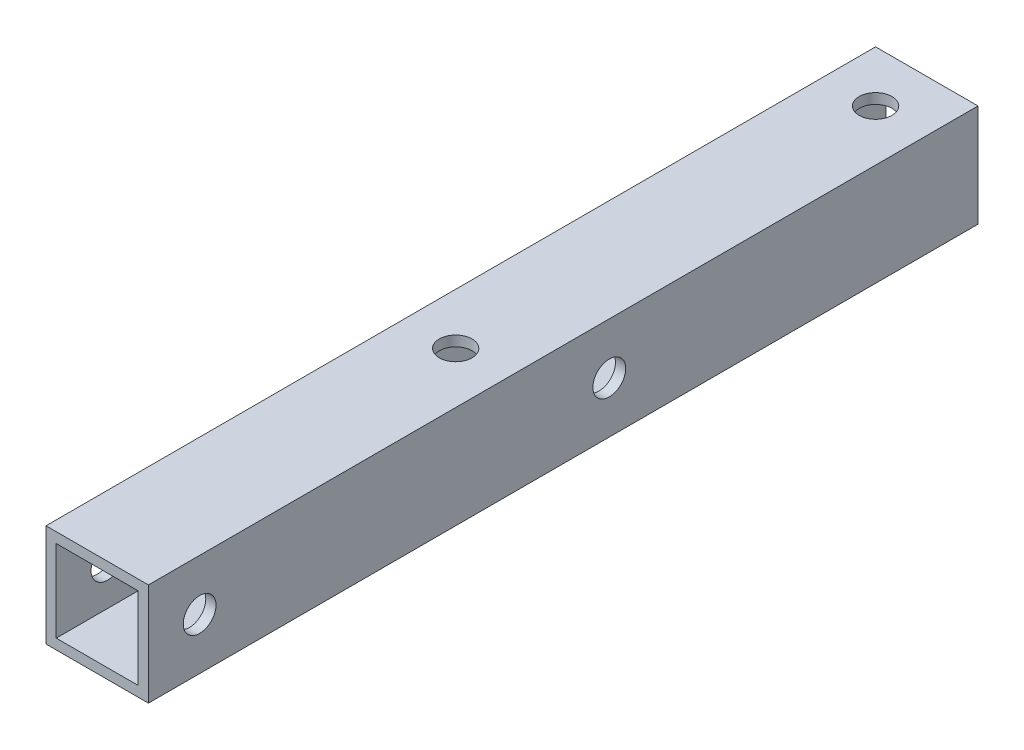
ISO-10303-21;
HEADER;
FILE_DESCRIPTION(('STEP AP214'),'2;1');
FILE_NAME('part.step','',(''),(''),'','','');
FILE_SCHEMA(('AUTOMOTIVE_DESIGN { 1 0 10303 214 1 1 1 1 }'));
ENDSEC;
DATA;
#1=APPLICATION_CONTEXT('core data for automotive mechanical design processes');
#2=APPLICATION_PROTOCOL_DEFINITION('international standard','automotive_design',2000,#1);
#3=PRODUCT_CONTEXT('',#1,'mechanical');
#4=PRODUCT('Part','Part','',(#3));
#5=PRODUCT_RELATED_PRODUCT_CATEGORY('part','',(#4));
#6=PRODUCT_DEFINITION_FORMATION('','',#4);
#7=PRODUCT_DEFINITION_CONTEXT('part definition',#1,'design');
#8=PRODUCT_DEFINITION('design','',#6,#7);
#9=PRODUCT_DEFINITION_SHAPE('','',#8);
#10=(LENGTH_UNIT() NAMED_UNIT(*) SI_UNIT(.MILLI.,.METRE.));
#11=(NAMED_UNIT(*) PLANE_ANGLE_UNIT() SI_UNIT($,.RADIAN.));
#12=(NAMED_UNIT(*) SI_UNIT($,.STERADIAN.) SOLID_ANGLE_UNIT());
#13=UNCERTAINTY_MEASURE_WITH_UNIT(LENGTH_MEASURE(1.E-05),#10,'distance_accuracy_value','');
#14=(GEOMETRIC_REPRESENTATION_CONTEXT(3) GLOBAL_UNCERTAINTY_ASSIGNED_CONTEXT((#13)) GLOBAL_UNIT_ASSIGNED_CONTEXT((#10,
#11,#12)) REPRESENTATION_CONTEXT('',''));
#15=CARTESIAN_POINT('',(0.,0.,0.));
#16=DIRECTION('',(0.,0.,1.));
#17=DIRECTION('',(1.,0.,0.));
#18=AXIS2_PLACEMENT_3D('',#15,#16,#17);
#19=CARTESIAN_POINT('',(0.,0.,0.));
#20=DIRECTION('',(0.,0.,1.));
#21=DIRECTION('',(1.,0.,0.));
#22=AXIS2_PLACEMENT_3D('',#19,#20,#21);
#23=PLANE('',#22);
#24=DIRECTION('',(0.,-1.,0.));
#25=VECTOR('',#24,1.);
#26=CARTESIAN_POINT('',(-5.,5.,0.));
#27=LINE('',#26,#25);
#28=CARTESIAN_POINT('',(-5.,5.,0.));
#29=VERTEX_POINT('',#28);
#30=CARTESIAN_POINT('',(-5.,-5.,0.));
#31=VERTEX_POINT('',#30);
#32=EDGE_CURVE('E135',#29,#31,#27,.T.);
#33=ORIENTED_EDGE('',*,*,#32,.F.);
#34=DIRECTION('',(-1.,0.,0.));
#35=VECTOR('',#34,1.);
#36=CARTESIAN_POINT('',(5.,5.,0.));
#37=LINE('',#36,#35);
#38=CARTESIAN_POINT('',(5.,5.,0.));
#39=VERTEX_POINT('',#38);
#40=EDGE_CURVE('E84',#39,#29,#37,.T.);
#41=ORIENTED_EDGE('',*,*,#40,.F.);
#42=DIRECTION('',(0.,1.,0.));
#43=VECTOR('',#42,1.);
#44=CARTESIAN_POINT('',(5.,5.,0.));
#45=LINE('',#44,#43);
#46=CARTESIAN_POINT('',(5.,-5.,0.));
#47=VERTEX_POINT('',#46);
#48=EDGE_CURVE('E214',#47,#39,#45,.T.);
#49=ORIENTED_EDGE('',*,*,#48,.F.);
#50=DIRECTION('',(1.,0.,0.));
#51=VECTOR('',#50,1.);
#52=CARTESIAN_POINT('',(5.,-5.,0.));
#53=LINE('',#52,#51);
#54=EDGE_CURVE('E212',#31,#47,#53,.T.);
#55=ORIENTED_EDGE('',*,*,#54,.F.);
#56=EDGE_LOOP('',(#33,#41,#49,#55));
#57=FACE_BOUND('',#56,.T.);
#58=DIRECTION('',(0.,-1.,0.));
#59=VECTOR('',#58,1.);
#60=CARTESIAN_POINT('',(-4.,0.,0.));
#61=LINE('',#60,#59);
#62=CARTESIAN_POINT('',(-4.,4.,0.));
#63=VERTEX_POINT('',#62);
#64=CARTESIAN_POINT('',(-4.,-4.,0.));
#65=VERTEX_POINT('',#64);
#66=EDGE_CURVE('E76',#63,#65,#61,.T.);
#67=ORIENTED_EDGE('',*,*,#66,.T.);
#68=DIRECTION('',(1.,0.,0.));
#69=VECTOR('',#68,1.);
#70=CARTESIAN_POINT('',(0.,-4.,0.));
#71=LINE('',#70,#69);
#72=CARTESIAN_POINT('',(4.,-4.,0.));
#73=VERTEX_POINT('',#72);
#74=EDGE_CURVE('E134',#65,#73,#71,.T.);
#75=ORIENTED_EDGE('',*,*,#74,.T.);
#76=DIRECTION('',(0.,1.,0.));
#77=VECTOR('',#76,1.);
#78=CARTESIAN_POINT('',(4.,0.,0.));
#79=LINE('',#78,#77);
#80=CARTESIAN_POINT('',(4.,4.,0.));
#81=VERTEX_POINT('',#80);
#82=EDGE_CURVE('E200',#73,#81,#79,.T.);
#83=ORIENTED_EDGE('',*,*,#82,.T.);
#84=DIRECTION('',(-1.,0.,0.));
#85=VECTOR('',#84,1.);
#86=CARTESIAN_POINT('',(0.,4.,0.));
#87=LINE('',#86,#85);
#88=EDGE_CURVE('E203',#81,#63,#87,.T.);
#89=ORIENTED_EDGE('',*,*,#88,.T.);
#90=EDGE_LOOP('',(#67,#75,#83,#89));
#91=FACE_BOUND('',#90,.T.);
#92=ADVANCED_FACE('F59',(#57,#91),#23,.F.);
#93=CARTESIAN_POINT('',(-5.,5.,51.));
#94=DIRECTION('',(1.,0.,0.));
#95=DIRECTION('',(0.,1.,0.));
#96=AXIS2_PLACEMENT_3D('',#93,#94,#95);
#97=PLANE('',#96);
#98=CARTESIAN_POINT('',(-5.,0.,76.));
#99=DIRECTION('',(1.,0.,0.));
#100=DIRECTION('',(0.,1.,0.));
#101=AXIS2_PLACEMENT_3D('',#98,#99,#100);
#102=CIRCLE('',#101,1.60000000000001);
#103=CARTESIAN_POINT('',(-5.,1.6,76.));
#104=VERTEX_POINT('',#103);
#105=EDGE_CURVE('E334',#104,#104,#102,.T.);
#106=ORIENTED_EDGE('',*,*,#105,.T.);
#107=EDGE_LOOP('',(#106));
#108=FACE_BOUND('',#107,.T.);
#109=CARTESIAN_POINT('',(-5.,0.,36.));
#110=DIRECTION('',(1.,0.,0.));
#111=DIRECTION('',(0.,1.,0.));
#112=AXIS2_PLACEMENT_3D('',#109,#110,#111);
#113=CIRCLE('',#112,1.6);
#114=CARTESIAN_POINT('',(-5.,1.6,36.));
#115=VERTEX_POINT('',#114);
#116=EDGE_CURVE('E189',#115,#115,#113,.T.);
#117=ORIENTED_EDGE('',*,*,#116,.T.);
#118=EDGE_LOOP('',(#117));
#119=FACE_BOUND('',#118,.T.);
#120=ORIENTED_EDGE('',*,*,#32,.T.);
#121=DIRECTION('',(0.,0.,-1.));
#122=VECTOR('',#121,1.);
#123=CARTESIAN_POINT('',(-5.,-5.,51.));
#124=LINE('',#123,#122);
#125=CARTESIAN_POINT('',(-5.,-5.,81.));
#126=VERTEX_POINT('',#125);
#127=EDGE_CURVE('E12',#126,#31,#124,.T.);
#128=ORIENTED_EDGE('',*,*,#127,.F.);
#129=DIRECTION('',(0.,-1.,0.));
#130=VECTOR('',#129,1.);
#131=CARTESIAN_POINT('',(-5.,5.,81.));
#132=LINE('',#131,#130);
#133=CARTESIAN_POINT('',(-5.,5.,81.));
#134=VERTEX_POINT('',#133);
#135=EDGE_CURVE('E156',#134,#126,#132,.T.);
#136=ORIENTED_EDGE('',*,*,#135,.F.);
#137=DIRECTION('',(0.,0.,-1.));
#138=VECTOR('',#137,1.);
#139=CARTESIAN_POINT('',(-5.,5.,51.));
#140=LINE('',#139,#138);
#141=EDGE_CURVE('E217',#134,#29,#140,.T.);
#142=ORIENTED_EDGE('',*,*,#141,.T.);
#143=EDGE_LOOP('',(#120,#128,#136,#142));
#144=FACE_BOUND('',#143,.T.);
#145=ADVANCED_FACE('F61',(#108,#119,#144),#97,.F.);
#146=CARTESIAN_POINT('',(5.,-5.,51.));
#147=DIRECTION('',(0.,1.,0.));
#148=DIRECTION('',(-1.,0.,0.));
#149=AXIS2_PLACEMENT_3D('',#146,#147,#148);
#150=PLANE('',#149);
#151=CARTESIAN_POINT('',(0.,-5.,46.));
#152=DIRECTION('',(0.,1.,0.));
#153=DIRECTION('',(-1.,0.,0.));
#154=AXIS2_PLACEMENT_3D('',#151,#152,#153);
#155=CIRCLE('',#154,1.59999999999999);
#156=CARTESIAN_POINT('',(-1.59999999999999,-5.,46.));
#157=VERTEX_POINT('',#156);
#158=EDGE_CURVE('E169',#157,#157,#155,.T.);
#159=ORIENTED_EDGE('',*,*,#158,.T.);
#160=EDGE_LOOP('',(#159));
#161=FACE_BOUND('',#160,.T.);
#162=CARTESIAN_POINT('',(0.,-5.,5.));
#163=DIRECTION('',(0.,1.,0.));
#164=DIRECTION('',(-1.,0.,0.));
#165=AXIS2_PLACEMENT_3D('',#162,#163,#164);
#166=CIRCLE('',#165,1.6);
#167=CARTESIAN_POINT('',(-1.6,-5.,5.));
#168=VERTEX_POINT('',#167);
#169=EDGE_CURVE('E176',#168,#168,#166,.T.);
#170=ORIENTED_EDGE('',*,*,#169,.T.);
#171=EDGE_LOOP('',(#170));
#172=FACE_BOUND('',#171,.T.);
#173=ORIENTED_EDGE('',*,*,#54,.T.);
#174=DIRECTION('',(0.,0.,-1.));
#175=VECTOR('',#174,1.);
#176=CARTESIAN_POINT('',(5.,-5.,51.));
#177=LINE('',#176,#175);
#178=CARTESIAN_POINT('',(5.,-5.,81.));
#179=VERTEX_POINT('',#178);
#180=EDGE_CURVE('E68',#179,#47,#177,.T.);
#181=ORIENTED_EDGE('',*,*,#180,.F.);
#182=DIRECTION('',(1.,0.,0.));
#183=VECTOR('',#182,1.);
#184=CARTESIAN_POINT('',(5.,-5.,81.));
#185=LINE('',#184,#183);
#186=EDGE_CURVE('E159',#126,#179,#185,.T.);
#187=ORIENTED_EDGE('',*,*,#186,.F.);
#188=ORIENTED_EDGE('',*,*,#127,.T.);
#189=EDGE_LOOP('',(#173,#181,#187,#188));
#190=FACE_BOUND('',#189,.T.);
#191=ADVANCED_FACE('F260',(#161,#172,#190),#150,.F.);
#192=CARTESIAN_POINT('',(5.,5.,51.));
#193=DIRECTION('',(-1.,0.,0.));
#194=DIRECTION('',(0.,-1.,0.));
#195=AXIS2_PLACEMENT_3D('',#192,#193,#194);
#196=PLANE('',#195);
#197=CARTESIAN_POINT('',(5.,0.,76.));
#198=DIRECTION('',(1.,0.,0.));
#199=DIRECTION('',(0.,1.,0.));
#200=AXIS2_PLACEMENT_3D('',#197,#198,#199);
#201=CIRCLE('',#200,1.60000000000001);
#202=CARTESIAN_POINT('',(5.,1.60000000000001,76.));
#203=VERTEX_POINT('',#202);
#204=EDGE_CURVE('E336',#203,#203,#201,.T.);
#205=ORIENTED_EDGE('',*,*,#204,.F.);
#206=EDGE_LOOP('',(#205));
#207=FACE_BOUND('',#206,.T.);
#208=CARTESIAN_POINT('',(5.,0.,36.));
#209=DIRECTION('',(1.,0.,0.));
#210=DIRECTION('',(0.,1.,0.));
#211=AXIS2_PLACEMENT_3D('',#208,#209,#210);
#212=CIRCLE('',#211,1.6);
#213=CARTESIAN_POINT('',(5.,1.6,36.));
#214=VERTEX_POINT('',#213);
#215=EDGE_CURVE('E188',#214,#214,#212,.T.);
#216=ORIENTED_EDGE('',*,*,#215,.F.);
#217=EDGE_LOOP('',(#216));
#218=FACE_BOUND('',#217,.T.);
#219=ORIENTED_EDGE('',*,*,#48,.T.);
#220=DIRECTION('',(0.,0.,-1.));
#221=VECTOR('',#220,1.);
#222=CARTESIAN_POINT('',(5.,5.,51.));
#223=LINE('',#222,#221);
#224=CARTESIAN_POINT('',(5.,5.,81.));
#225=VERTEX_POINT('',#224);
#226=EDGE_CURVE('E219',#225,#39,#223,.T.);
#227=ORIENTED_EDGE('',*,*,#226,.F.);
#228=DIRECTION('',(0.,1.,0.));
#229=VECTOR('',#228,1.);
#230=CARTESIAN_POINT('',(5.,5.,81.));
#231=LINE('',#230,#229);
#232=EDGE_CURVE('E162',#179,#225,#231,.T.);
#233=ORIENTED_EDGE('',*,*,#232,.F.);
#234=ORIENTED_EDGE('',*,*,#180,.T.);
#235=EDGE_LOOP('',(#219,#227,#233,#234));
#236=FACE_BOUND('',#235,.T.);
#237=ADVANCED_FACE('F268',(#207,#218,#236),#196,.F.);
#238=CARTESIAN_POINT('',(5.,5.,51.));
#239=DIRECTION('',(0.,-1.,0.));
#240=DIRECTION('',(1.,0.,0.));
#241=AXIS2_PLACEMENT_3D('',#238,#239,#240);
#242=PLANE('',#241);
#243=CARTESIAN_POINT('',(0.,5.,46.));
#244=DIRECTION('',(0.,1.,0.));
#245=DIRECTION('',(-1.,0.,0.));
#246=AXIS2_PLACEMENT_3D('',#243,#244,#245);
#247=CIRCLE('',#246,1.59999999999999);
#248=CARTESIAN_POINT('',(-1.59999999999999,5.,46.));
#249=VERTEX_POINT('',#248);
#250=EDGE_CURVE('E173',#249,#249,#247,.T.);
#251=ORIENTED_EDGE('',*,*,#250,.F.);
#252=EDGE_LOOP('',(#251));
#253=FACE_BOUND('',#252,.T.);
#254=CARTESIAN_POINT('',(0.,5.,5.));
#255=DIRECTION('',(0.,1.,0.));
#256=DIRECTION('',(-1.,0.,0.));
#257=AXIS2_PLACEMENT_3D('',#254,#255,#256);
#258=CIRCLE('',#257,1.6);
#259=CARTESIAN_POINT('',(-1.6,5.,5.));
#260=VERTEX_POINT('',#259);
#261=EDGE_CURVE('E168',#260,#260,#258,.T.);
#262=ORIENTED_EDGE('',*,*,#261,.F.);
#263=EDGE_LOOP('',(#262));
#264=FACE_BOUND('',#263,.T.);
#265=ORIENTED_EDGE('',*,*,#40,.T.);
#266=ORIENTED_EDGE('',*,*,#141,.F.);
#267=DIRECTION('',(-1.,0.,0.));
#268=VECTOR('',#267,1.);
#269=CARTESIAN_POINT('',(5.,5.,81.));
#270=LINE('',#269,#268);
#271=EDGE_CURVE('E165',#225,#134,#270,.T.);
#272=ORIENTED_EDGE('',*,*,#271,.F.);
#273=ORIENTED_EDGE('',*,*,#226,.T.);
#274=EDGE_LOOP('',(#265,#266,#272,#273));
#275=FACE_BOUND('',#274,.T.);
#276=ADVANCED_FACE('F265',(#253,#264,#275),#242,.F.);
#277=CARTESIAN_POINT('',(-4.,0.,51.));
#278=DIRECTION('',(1.,0.,0.));
#279=DIRECTION('',(0.,1.,0.));
#280=AXIS2_PLACEMENT_3D('',#277,#278,#279);
#281=PLANE('',#280);
#282=CARTESIAN_POINT('',(-4.,0.,76.));
#283=DIRECTION('',(1.,0.,0.));
#284=DIRECTION('',(0.,1.,0.));
#285=AXIS2_PLACEMENT_3D('',#282,#283,#284);
#286=CIRCLE('',#285,1.60000000000001);
#287=CARTESIAN_POINT('',(-4.,1.6,76.));
#288=VERTEX_POINT('',#287);
#289=EDGE_CURVE('E145',#288,#288,#286,.T.);
#290=ORIENTED_EDGE('',*,*,#289,.F.);
#291=EDGE_LOOP('',(#290));
#292=FACE_BOUND('',#291,.T.);
#293=CARTESIAN_POINT('',(-4.,0.,36.));
#294=DIRECTION('',(1.,0.,0.));
#295=DIRECTION('',(0.,1.,0.));
#296=AXIS2_PLACEMENT_3D('',#293,#294,#295);
#297=CIRCLE('',#296,1.6);
#298=CARTESIAN_POINT('',(-4.,1.6,36.));
#299=VERTEX_POINT('',#298);
#300=EDGE_CURVE('E195',#299,#299,#297,.T.);
#301=ORIENTED_EDGE('',*,*,#300,.F.);
#302=EDGE_LOOP('',(#301));
#303=FACE_BOUND('',#302,.T.);
#304=ORIENTED_EDGE('',*,*,#66,.F.);
#305=DIRECTION('',(0.,0.,-1.));
#306=VECTOR('',#305,1.);
#307=CARTESIAN_POINT('',(-4.,4.,51.));
#308=LINE('',#307,#306);
#309=CARTESIAN_POINT('',(-4.,4.,81.));
#310=VERTEX_POINT('',#309);
#311=EDGE_CURVE('E141',#310,#63,#308,.T.);
#312=ORIENTED_EDGE('',*,*,#311,.F.);
#313=DIRECTION('',(0.,-1.,0.));
#314=VECTOR('',#313,1.);
#315=CARTESIAN_POINT('',(-4.,4.,81.));
#316=LINE('',#315,#314);
#317=CARTESIAN_POINT('',(-4.,-4.,81.));
#318=VERTEX_POINT('',#317);
#319=EDGE_CURVE('E139',#310,#318,#316,.T.);
#320=ORIENTED_EDGE('',*,*,#319,.T.);
#321=DIRECTION('',(0.,0.,-1.));
#322=VECTOR('',#321,1.);
#323=CARTESIAN_POINT('',(-4.,-4.,51.));
#324=LINE('',#323,#322);
#325=EDGE_CURVE('E127',#318,#65,#324,.T.);
#326=ORIENTED_EDGE('',*,*,#325,.T.);
#327=EDGE_LOOP('',(#304,#312,#320,#326));
#328=FACE_BOUND('',#327,.T.);
#329=ADVANCED_FACE('F140',(#292,#303,#328),#281,.T.);
#330=CARTESIAN_POINT('',(0.,-4.,51.));
#331=DIRECTION('',(0.,1.,0.));
#332=DIRECTION('',(-1.,0.,0.));
#333=AXIS2_PLACEMENT_3D('',#330,#331,#332);
#334=PLANE('',#333);
#335=CARTESIAN_POINT('',(0.,-4.,46.));
#336=DIRECTION('',(0.,1.,0.));
#337=DIRECTION('',(-1.,0.,0.));
#338=AXIS2_PLACEMENT_3D('',#335,#336,#337);
#339=CIRCLE('',#338,1.59999999999999);
#340=CARTESIAN_POINT('',(-1.59999999999999,-4.,46.));
#341=VERTEX_POINT('',#340);
#342=EDGE_CURVE('E185',#341,#341,#339,.T.);
#343=ORIENTED_EDGE('',*,*,#342,.F.);
#344=EDGE_LOOP('',(#343));
#345=FACE_BOUND('',#344,.T.);
#346=CARTESIAN_POINT('',(0.,-4.,5.));
#347=DIRECTION('',(0.,1.,0.));
#348=DIRECTION('',(-1.,0.,0.));
#349=AXIS2_PLACEMENT_3D('',#346,#347,#348);
#350=CIRCLE('',#349,1.6);
#351=CARTESIAN_POINT('',(-1.6,-4.,5.));
#352=VERTEX_POINT('',#351);
#353=EDGE_CURVE('E181',#352,#352,#350,.T.);
#354=ORIENTED_EDGE('',*,*,#353,.F.);
#355=EDGE_LOOP('',(#354));
#356=FACE_BOUND('',#355,.T.);
#357=ORIENTED_EDGE('',*,*,#74,.F.);
#358=ORIENTED_EDGE('',*,*,#325,.F.);
#359=DIRECTION('',(1.,0.,0.));
#360=VECTOR('',#359,1.);
#361=CARTESIAN_POINT('',(4.,-4.,81.));
#362=LINE('',#361,#360);
#363=CARTESIAN_POINT('',(4.,-4.,81.));
#364=VERTEX_POINT('',#363);
#365=EDGE_CURVE('E131',#318,#364,#362,.T.);
#366=ORIENTED_EDGE('',*,*,#365,.T.);
#367=DIRECTION('',(0.,0.,-1.));
#368=VECTOR('',#367,1.);
#369=CARTESIAN_POINT('',(4.,-4.,51.));
#370=LINE('',#369,#368);
#371=EDGE_CURVE('E136',#364,#73,#370,.T.);
#372=ORIENTED_EDGE('',*,*,#371,.T.);
#373=EDGE_LOOP('',(#357,#358,#366,#372));
#374=FACE_BOUND('',#373,.T.);
#375=ADVANCED_FACE('F129',(#345,#356,#374),#334,.T.);
#376=CARTESIAN_POINT('',(4.,0.,51.));
#377=DIRECTION('',(-1.,0.,0.));
#378=DIRECTION('',(0.,-1.,0.));
#379=AXIS2_PLACEMENT_3D('',#376,#377,#378);
#380=PLANE('',#379);
#381=CARTESIAN_POINT('',(4.,0.,76.));
#382=DIRECTION('',(-1.,0.,0.));
#383=DIRECTION('',(0.,-1.,0.));
#384=AXIS2_PLACEMENT_3D('',#381,#382,#383);
#385=CIRCLE('',#384,1.60000000000001);
#386=CARTESIAN_POINT('',(4.,-1.6,76.));
#387=VERTEX_POINT('',#386);
#388=EDGE_CURVE('E63',#387,#387,#385,.T.);
#389=ORIENTED_EDGE('',*,*,#388,.F.);
#390=EDGE_LOOP('',(#389));
#391=FACE_BOUND('',#390,.T.);
#392=CARTESIAN_POINT('',(4.,0.,36.));
#393=DIRECTION('',(-1.,0.,0.));
#394=DIRECTION('',(0.,-1.,0.));
#395=AXIS2_PLACEMENT_3D('',#392,#393,#394);
#396=CIRCLE('',#395,1.6);
#397=CARTESIAN_POINT('',(4.,-1.6,36.));
#398=VERTEX_POINT('',#397);
#399=EDGE_CURVE('E192',#398,#398,#396,.T.);
#400=ORIENTED_EDGE('',*,*,#399,.F.);
#401=EDGE_LOOP('',(#400));
#402=FACE_BOUND('',#401,.T.);
#403=ORIENTED_EDGE('',*,*,#82,.F.);
#404=ORIENTED_EDGE('',*,*,#371,.F.);
#405=DIRECTION('',(0.,1.,0.));
#406=VECTOR('',#405,1.);
#407=CARTESIAN_POINT('',(4.,4.,81.));
#408=LINE('',#407,#406);
#409=CARTESIAN_POINT('',(4.,4.,81.));
#410=VERTEX_POINT('',#409);
#411=EDGE_CURVE('E149',#364,#410,#408,.T.);
#412=ORIENTED_EDGE('',*,*,#411,.T.);
#413=DIRECTION('',(0.,0.,-1.));
#414=VECTOR('',#413,1.);
#415=CARTESIAN_POINT('',(4.,4.,51.));
#416=LINE('',#415,#414);
#417=EDGE_CURVE('E207',#410,#81,#416,.T.);
#418=ORIENTED_EDGE('',*,*,#417,.T.);
#419=EDGE_LOOP('',(#403,#404,#412,#418));
#420=FACE_BOUND('',#419,.T.);
#421=ADVANCED_FACE('F236',(#391,#402,#420),#380,.T.);
#422=CARTESIAN_POINT('',(0.,4.,51.));
#423=DIRECTION('',(0.,-1.,0.));
#424=DIRECTION('',(1.,0.,0.));
#425=AXIS2_PLACEMENT_3D('',#422,#423,#424);
#426=PLANE('',#425);
#427=CARTESIAN_POINT('',(0.,4.,46.));
#428=DIRECTION('',(0.,-1.,0.));
#429=DIRECTION('',(1.,0.,0.));
#430=AXIS2_PLACEMENT_3D('',#427,#428,#429);
#431=CIRCLE('',#430,1.59999999999999);
#432=CARTESIAN_POINT('',(1.6,4.,46.));
#433=VERTEX_POINT('',#432);
#434=EDGE_CURVE('E184',#433,#433,#431,.T.);
#435=ORIENTED_EDGE('',*,*,#434,.F.);
#436=EDGE_LOOP('',(#435));
#437=FACE_BOUND('',#436,.T.);
#438=CARTESIAN_POINT('',(0.,4.,5.));
#439=DIRECTION('',(0.,-1.,0.));
#440=DIRECTION('',(1.,0.,0.));
#441=AXIS2_PLACEMENT_3D('',#438,#439,#440);
#442=CIRCLE('',#441,1.6);
#443=CARTESIAN_POINT('',(1.6,4.,5.));
#444=VERTEX_POINT('',#443);
#445=EDGE_CURVE('E172',#444,#444,#442,.T.);
#446=ORIENTED_EDGE('',*,*,#445,.F.);
#447=EDGE_LOOP('',(#446));
#448=FACE_BOUND('',#447,.T.);
#449=ORIENTED_EDGE('',*,*,#88,.F.);
#450=ORIENTED_EDGE('',*,*,#417,.F.);
#451=DIRECTION('',(-1.,0.,0.));
#452=VECTOR('',#451,1.);
#453=CARTESIAN_POINT('',(4.,4.,81.));
#454=LINE('',#453,#452);
#455=EDGE_CURVE('E151',#410,#310,#454,.T.);
#456=ORIENTED_EDGE('',*,*,#455,.T.);
#457=ORIENTED_EDGE('',*,*,#311,.T.);
#458=EDGE_LOOP('',(#449,#450,#456,#457));
#459=FACE_BOUND('',#458,.T.);
#460=ADVANCED_FACE('F232',(#437,#448,#459),#426,.T.);
#461=CARTESIAN_POINT('',(-5.,0.,36.));
#462=DIRECTION('',(1.,0.,0.));
#463=DIRECTION('',(0.,1.,0.));
#464=AXIS2_PLACEMENT_3D('',#461,#462,#463);
#465=CYLINDRICAL_SURFACE('',#464,1.6);
#466=ORIENTED_EDGE('',*,*,#399,.T.);
#467=EDGE_LOOP('',(#466));
#468=FACE_BOUND('',#467,.T.);
#469=ORIENTED_EDGE('',*,*,#215,.T.);
#470=EDGE_LOOP('',(#469));
#471=FACE_BOUND('',#470,.T.);
#472=ADVANCED_FACE('F235',(#468,#471),#465,.F.);
#473=ORIENTED_EDGE('',*,*,#300,.T.);
#474=EDGE_LOOP('',(#473));
#475=FACE_BOUND('',#474,.T.);
#476=ORIENTED_EDGE('',*,*,#116,.F.);
#477=EDGE_LOOP('',(#476));
#478=FACE_BOUND('',#477,.T.);
#479=ADVANCED_FACE('F307',(#475,#478),#465,.F.);
#480=CARTESIAN_POINT('',(0.,-5.,5.));
#481=DIRECTION('',(0.,1.,0.));
#482=DIRECTION('',(-1.,0.,0.));
#483=AXIS2_PLACEMENT_3D('',#480,#481,#482);
#484=CYLINDRICAL_SURFACE('',#483,1.6);
#485=ORIENTED_EDGE('',*,*,#445,.T.);
#486=EDGE_LOOP('',(#485));
#487=FACE_BOUND('',#486,.T.);
#488=ORIENTED_EDGE('',*,*,#261,.T.);
#489=EDGE_LOOP('',(#488));
#490=FACE_BOUND('',#489,.T.);
#491=ADVANCED_FACE('F304',(#487,#490),#484,.F.);
#492=CARTESIAN_POINT('',(0.,-5.,46.));
#493=DIRECTION('',(0.,1.,0.));
#494=DIRECTION('',(-1.,0.,0.));
#495=AXIS2_PLACEMENT_3D('',#492,#493,#494);
#496=CYLINDRICAL_SURFACE('',#495,1.59999999999999);
#497=ORIENTED_EDGE('',*,*,#434,.T.);
#498=EDGE_LOOP('',(#497));
#499=FACE_BOUND('',#498,.T.);
#500=ORIENTED_EDGE('',*,*,#250,.T.);
#501=EDGE_LOOP('',(#500));
#502=FACE_BOUND('',#501,.T.);
#503=ADVANCED_FACE('F229',(#499,#502),#496,.F.);
#504=ORIENTED_EDGE('',*,*,#353,.T.);
#505=EDGE_LOOP('',(#504));
#506=FACE_BOUND('',#505,.T.);
#507=ORIENTED_EDGE('',*,*,#169,.F.);
#508=EDGE_LOOP('',(#507));
#509=FACE_BOUND('',#508,.T.);
#510=ADVANCED_FACE('F299',(#506,#509),#484,.F.);
#511=ORIENTED_EDGE('',*,*,#342,.T.);
#512=EDGE_LOOP('',(#511));
#513=FACE_BOUND('',#512,.T.);
#514=ORIENTED_EDGE('',*,*,#158,.F.);
#515=EDGE_LOOP('',(#514));
#516=FACE_BOUND('',#515,.T.);
#517=ADVANCED_FACE('F290',(#513,#516),#496,.F.);
#518=CARTESIAN_POINT('',(0.,0.,81.));
#519=DIRECTION('',(0.,0.,-1.));
#520=DIRECTION('',(-1.,0.,0.));
#521=AXIS2_PLACEMENT_3D('',#518,#519,#520);
#522=PLANE('',#521);
#523=ORIENTED_EDGE('',*,*,#135,.T.);
#524=ORIENTED_EDGE('',*,*,#186,.T.);
#525=ORIENTED_EDGE('',*,*,#232,.T.);
#526=ORIENTED_EDGE('',*,*,#271,.T.);
#527=EDGE_LOOP('',(#523,#524,#525,#526));
#528=FACE_BOUND('',#527,.T.);
#529=ORIENTED_EDGE('',*,*,#319,.F.);
#530=ORIENTED_EDGE('',*,*,#455,.F.);
#531=ORIENTED_EDGE('',*,*,#411,.F.);
#532=ORIENTED_EDGE('',*,*,#365,.F.);
#533=EDGE_LOOP('',(#529,#530,#531,#532));
#534=FACE_BOUND('',#533,.T.);
#535=ADVANCED_FACE('F147',(#528,#534),#522,.F.);
#536=CARTESIAN_POINT('',(-5.,0.,76.));
#537=DIRECTION('',(1.,0.,0.));
#538=DIRECTION('',(0.,1.,0.));
#539=AXIS2_PLACEMENT_3D('',#536,#537,#538);
#540=CYLINDRICAL_SURFACE('',#539,1.60000000000001);
#541=ORIENTED_EDGE('',*,*,#388,.T.);
#542=EDGE_LOOP('',(#541));
#543=FACE_BOUND('',#542,.T.);
#544=ORIENTED_EDGE('',*,*,#204,.T.);
#545=EDGE_LOOP('',(#544));
#546=FACE_BOUND('',#545,.T.);
#547=ADVANCED_FACE('F289',(#543,#546),#540,.F.);
#548=ORIENTED_EDGE('',*,*,#289,.T.);
#549=EDGE_LOOP('',(#548));
#550=FACE_BOUND('',#549,.T.);
#551=ORIENTED_EDGE('',*,*,#105,.F.);
#552=EDGE_LOOP('',(#551));
#553=FACE_BOUND('',#552,.T.);
#554=ADVANCED_FACE('F296',(#550,#553),#540,.F.);
#555=CLOSED_SHELL('',(#92,#145,#191,#237,#276,#329,#375,#421,#460,#472,#479,#491,#503,#510,#517,
#535,#547,#554));
#556=MANIFOLD_SOLID_BREP('B2',#555);
#557=ADVANCED_BREP_SHAPE_REPRESENTATION('',(#18,#556),#14);
#558=SHAPE_DEFINITION_REPRESENTATION(#9,#557);
ENDSEC;
END-ISO-10303-21;
